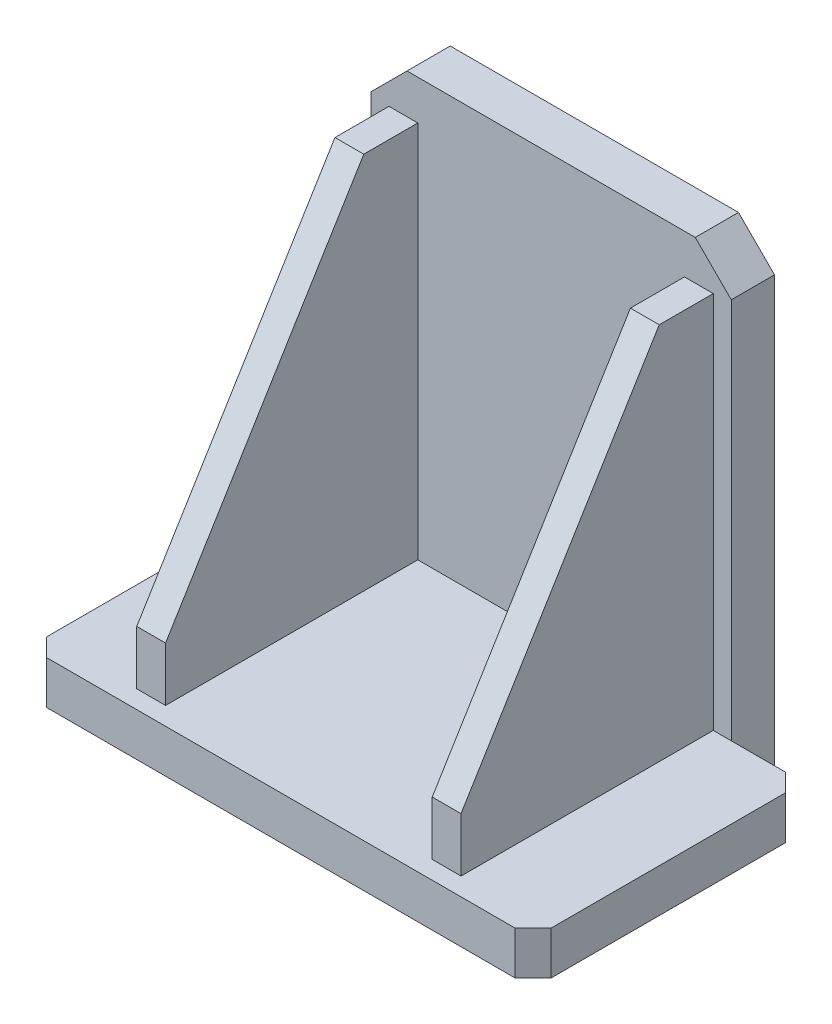
ISO-10303-21;
HEADER;
FILE_DESCRIPTION(('STEP AP214'),'2;1');
FILE_NAME('part.step','',(''),(''),'','','');
FILE_SCHEMA(('AUTOMOTIVE_DESIGN { 1 0 10303 214 1 1 1 1 }'));
ENDSEC;
DATA;
#1=APPLICATION_CONTEXT('core data for automotive mechanical design processes');
#2=APPLICATION_PROTOCOL_DEFINITION('international standard','automotive_design',2000,#1);
#3=PRODUCT_CONTEXT('',#1,'mechanical');
#4=PRODUCT('Part','Part','',(#3));
#5=PRODUCT_RELATED_PRODUCT_CATEGORY('part','',(#4));
#6=PRODUCT_DEFINITION_FORMATION('','',#4);
#7=PRODUCT_DEFINITION_CONTEXT('part definition',#1,'design');
#8=PRODUCT_DEFINITION('design','',#6,#7);
#9=PRODUCT_DEFINITION_SHAPE('','',#8);
#10=(LENGTH_UNIT() NAMED_UNIT(*) SI_UNIT(.MILLI.,.METRE.));
#11=(NAMED_UNIT(*) PLANE_ANGLE_UNIT() SI_UNIT($,.RADIAN.));
#12=(NAMED_UNIT(*) SI_UNIT($,.STERADIAN.) SOLID_ANGLE_UNIT());
#13=UNCERTAINTY_MEASURE_WITH_UNIT(LENGTH_MEASURE(1.E-05),#10,'distance_accuracy_value','');
#14=(GEOMETRIC_REPRESENTATION_CONTEXT(3) GLOBAL_UNCERTAINTY_ASSIGNED_CONTEXT((#13)) GLOBAL_UNIT_ASSIGNED_CONTEXT((#10,
#11,#12)) REPRESENTATION_CONTEXT('',''));
#15=CARTESIAN_POINT('',(0.,0.,0.));
#16=DIRECTION('',(0.,0.,1.));
#17=DIRECTION('',(1.,0.,0.));
#18=AXIS2_PLACEMENT_3D('',#15,#16,#17);
#19=CARTESIAN_POINT('',(25.,117.,-75.));
#20=DIRECTION('',(0.,-1.,0.));
#21=DIRECTION('',(0.,0.,-1.));
#22=AXIS2_PLACEMENT_3D('',#19,#20,#21);
#23=PLANE('',#22);
#24=DIRECTION('',(0.,0.,-1.));
#25=VECTOR('',#24,1.);
#26=CARTESIAN_POINT('',(33.,117.,-75.));
#27=LINE('',#26,#25);
#28=CARTESIAN_POINT('',(33.,117.,-60.));
#29=VERTEX_POINT('',#28);
#30=CARTESIAN_POINT('',(33.,117.,-75.));
#31=VERTEX_POINT('',#30);
#32=EDGE_CURVE('E126',#29,#31,#27,.T.);
#33=ORIENTED_EDGE('',*,*,#32,.T.);
#34=DIRECTION('',(1.,0.,0.));
#35=VECTOR('',#34,1.);
#36=CARTESIAN_POINT('',(25.,117.,-75.));
#37=LINE('',#36,#35);
#38=CARTESIAN_POINT('',(25.,117.,-75.));
#39=VERTEX_POINT('',#38);
#40=EDGE_CURVE('E12',#39,#31,#37,.T.);
#41=ORIENTED_EDGE('',*,*,#40,.F.);
#42=DIRECTION('',(0.,0.,-1.));
#43=VECTOR('',#42,1.);
#44=CARTESIAN_POINT('',(25.,117.,-75.));
#45=LINE('',#44,#43);
#46=CARTESIAN_POINT('',(25.,117.,-60.));
#47=VERTEX_POINT('',#46);
#48=EDGE_CURVE('E134',#47,#39,#45,.T.);
#49=ORIENTED_EDGE('',*,*,#48,.F.);
#50=DIRECTION('',(1.,0.,0.));
#51=VECTOR('',#50,1.);
#52=CARTESIAN_POINT('',(25.,117.,-60.));
#53=LINE('',#52,#51);
#54=EDGE_CURVE('E122',#47,#29,#53,.T.);
#55=ORIENTED_EDGE('',*,*,#54,.T.);
#56=EDGE_LOOP('',(#33,#41,#49,#55));
#57=FACE_BOUND('',#56,.T.);
#58=ADVANCED_FACE('F52',(#57),#23,.F.);
#59=CARTESIAN_POINT('',(25.,12.,-75.));
#60=DIRECTION('',(0.,0.,1.));
#61=DIRECTION('',(1.,0.,0.));
#62=AXIS2_PLACEMENT_3D('',#59,#60,#61);
#63=PLANE('',#62);
#64=DIRECTION('',(0.,-1.,0.));
#65=VECTOR('',#64,1.);
#66=CARTESIAN_POINT('',(33.,12.,-75.));
#67=LINE('',#66,#65);
#68=CARTESIAN_POINT('',(33.,12.,-75.));
#69=VERTEX_POINT('',#68);
#70=EDGE_CURVE('E129',#31,#69,#67,.T.);
#71=ORIENTED_EDGE('',*,*,#70,.T.);
#72=DIRECTION('',(1.,0.,0.));
#73=VECTOR('',#72,1.);
#74=CARTESIAN_POINT('',(25.,12.,-75.));
#75=LINE('',#74,#73);
#76=CARTESIAN_POINT('',(25.,12.,-75.));
#77=VERTEX_POINT('',#76);
#78=EDGE_CURVE('E60',#77,#69,#75,.T.);
#79=ORIENTED_EDGE('',*,*,#78,.F.);
#80=DIRECTION('',(0.,-1.,0.));
#81=VECTOR('',#80,1.);
#82=CARTESIAN_POINT('',(25.,12.,-75.));
#83=LINE('',#82,#81);
#84=EDGE_CURVE('E102',#39,#77,#83,.T.);
#85=ORIENTED_EDGE('',*,*,#84,.F.);
#86=ORIENTED_EDGE('',*,*,#40,.T.);
#87=EDGE_LOOP('',(#71,#79,#85,#86));
#88=FACE_BOUND('',#87,.T.);
#89=ADVANCED_FACE('F153',(#88),#63,.F.);
#90=CARTESIAN_POINT('',(25.,12.,-75.));
#91=DIRECTION('',(0.,1.,0.));
#92=DIRECTION('',(0.,0.,1.));
#93=AXIS2_PLACEMENT_3D('',#90,#91,#92);
#94=PLANE('',#93);
#95=DIRECTION('',(0.,0.,1.));
#96=VECTOR('',#95,1.);
#97=CARTESIAN_POINT('',(33.,12.,-75.));
#98=LINE('',#97,#96);
#99=CARTESIAN_POINT('',(33.,12.,-5.));
#100=VERTEX_POINT('',#99);
#101=EDGE_CURVE('E117',#69,#100,#98,.T.);
#102=ORIENTED_EDGE('',*,*,#101,.T.);
#103=DIRECTION('',(1.,0.,0.));
#104=VECTOR('',#103,1.);
#105=CARTESIAN_POINT('',(25.,12.,-5.));
#106=LINE('',#105,#104);
#107=CARTESIAN_POINT('',(25.,12.,-5.));
#108=VERTEX_POINT('',#107);
#109=EDGE_CURVE('E114',#108,#100,#106,.T.);
#110=ORIENTED_EDGE('',*,*,#109,.F.);
#111=DIRECTION('',(0.,0.,1.));
#112=VECTOR('',#111,1.);
#113=CARTESIAN_POINT('',(25.,12.,-75.));
#114=LINE('',#113,#112);
#115=EDGE_CURVE('E106',#77,#108,#114,.T.);
#116=ORIENTED_EDGE('',*,*,#115,.F.);
#117=ORIENTED_EDGE('',*,*,#78,.T.);
#118=EDGE_LOOP('',(#102,#110,#116,#117));
#119=FACE_BOUND('',#118,.T.);
#120=ADVANCED_FACE('F115',(#119),#94,.F.);
#121=CARTESIAN_POINT('',(25.,12.,-5.));
#122=DIRECTION('',(0.,0.,-1.));
#123=DIRECTION('',(-1.,0.,0.));
#124=AXIS2_PLACEMENT_3D('',#121,#122,#123);
#125=PLANE('',#124);
#126=DIRECTION('',(0.,1.,0.));
#127=VECTOR('',#126,1.);
#128=CARTESIAN_POINT('',(33.,12.,-5.));
#129=LINE('',#128,#127);
#130=CARTESIAN_POINT('',(33.,27.,-5.));
#131=VERTEX_POINT('',#130);
#132=EDGE_CURVE('E88',#100,#131,#129,.T.);
#133=ORIENTED_EDGE('',*,*,#132,.T.);
#134=DIRECTION('',(1.,0.,0.));
#135=VECTOR('',#134,1.);
#136=CARTESIAN_POINT('',(25.,27.,-5.));
#137=LINE('',#136,#135);
#138=CARTESIAN_POINT('',(25.,27.,-5.));
#139=VERTEX_POINT('',#138);
#140=EDGE_CURVE('E118',#139,#131,#137,.T.);
#141=ORIENTED_EDGE('',*,*,#140,.F.);
#142=DIRECTION('',(0.,1.,0.));
#143=VECTOR('',#142,1.);
#144=CARTESIAN_POINT('',(25.,12.,-5.));
#145=LINE('',#144,#143);
#146=EDGE_CURVE('E110',#108,#139,#145,.T.);
#147=ORIENTED_EDGE('',*,*,#146,.F.);
#148=ORIENTED_EDGE('',*,*,#109,.T.);
#149=EDGE_LOOP('',(#133,#141,#147,#148));
#150=FACE_BOUND('',#149,.T.);
#151=ADVANCED_FACE('F120',(#150),#125,.F.);
#152=CARTESIAN_POINT('',(25.,117.,-60.));
#153=DIRECTION('',(0.,-0.521450009453975,-0.853281833651959));
#154=DIRECTION('',(0.,0.853281833651959,-0.521450009453975));
#155=AXIS2_PLACEMENT_3D('',#152,#153,#154);
#156=PLANE('',#155);
#157=DIRECTION('',(0.,0.853281833651959,-0.521450009453975));
#158=VECTOR('',#157,1.);
#159=CARTESIAN_POINT('',(33.,117.,-60.));
#160=LINE('',#159,#158);
#161=EDGE_CURVE('E94',#131,#29,#160,.T.);
#162=ORIENTED_EDGE('',*,*,#161,.T.);
#163=ORIENTED_EDGE('',*,*,#54,.F.);
#164=DIRECTION('',(0.,0.853281833651959,-0.521450009453975));
#165=VECTOR('',#164,1.);
#166=CARTESIAN_POINT('',(25.,117.,-60.));
#167=LINE('',#166,#165);
#168=EDGE_CURVE('E68',#139,#47,#167,.T.);
#169=ORIENTED_EDGE('',*,*,#168,.F.);
#170=ORIENTED_EDGE('',*,*,#140,.T.);
#171=EDGE_LOOP('',(#162,#163,#169,#170));
#172=FACE_BOUND('',#171,.T.);
#173=ADVANCED_FACE('F142',(#172),#156,.F.);
#174=CARTESIAN_POINT('',(25.,0.,0.));
#175=DIRECTION('',(-1.,0.,0.));
#176=DIRECTION('',(0.,0.,1.));
#177=AXIS2_PLACEMENT_3D('',#174,#175,#176);
#178=PLANE('',#177);
#179=ORIENTED_EDGE('',*,*,#48,.T.);
#180=ORIENTED_EDGE('',*,*,#84,.T.);
#181=ORIENTED_EDGE('',*,*,#115,.T.);
#182=ORIENTED_EDGE('',*,*,#146,.T.);
#183=ORIENTED_EDGE('',*,*,#168,.T.);
#184=EDGE_LOOP('',(#179,#180,#181,#182,#183));
#185=FACE_BOUND('',#184,.T.);
#186=ADVANCED_FACE('F108',(#185),#178,.T.);
#187=CARTESIAN_POINT('',(33.,0.,0.));
#188=DIRECTION('',(-1.,0.,0.));
#189=DIRECTION('',(0.,0.,1.));
#190=AXIS2_PLACEMENT_3D('',#187,#188,#189);
#191=PLANE('',#190);
#192=ORIENTED_EDGE('',*,*,#32,.F.);
#193=ORIENTED_EDGE('',*,*,#161,.F.);
#194=ORIENTED_EDGE('',*,*,#132,.F.);
#195=ORIENTED_EDGE('',*,*,#101,.F.);
#196=ORIENTED_EDGE('',*,*,#70,.F.);
#197=EDGE_LOOP('',(#192,#193,#194,#195,#196));
#198=FACE_BOUND('',#197,.T.);
#199=ADVANCED_FACE('F138',(#198),#191,.F.);
#200=CLOSED_SHELL('',(#58,#89,#120,#151,#173,#186,#199));
#201=MANIFOLD_SOLID_BREP('B2',#200);
#202=CARTESIAN_POINT('',(115.,117.,-75.));
#203=DIRECTION('',(0.,-1.,0.));
#204=DIRECTION('',(0.,0.,-1.));
#205=AXIS2_PLACEMENT_3D('',#202,#203,#204);
#206=PLANE('',#205);
#207=DIRECTION('',(0.,0.,1.));
#208=VECTOR('',#207,1.);
#209=CARTESIAN_POINT('',(107.,117.,-75.));
#210=LINE('',#209,#208);
#211=CARTESIAN_POINT('',(107.,117.,-75.));
#212=VERTEX_POINT('',#211);
#213=CARTESIAN_POINT('',(107.,117.,-60.));
#214=VERTEX_POINT('',#213);
#215=EDGE_CURVE('E286',#212,#214,#210,.T.);
#216=ORIENTED_EDGE('',*,*,#215,.T.);
#217=DIRECTION('',(-1.,0.,0.));
#218=VECTOR('',#217,1.);
#219=CARTESIAN_POINT('',(115.,117.,-60.));
#220=LINE('',#219,#218);
#221=CARTESIAN_POINT('',(115.,117.,-60.));
#222=VERTEX_POINT('',#221);
#223=EDGE_CURVE('E50',#222,#214,#220,.T.);
#224=ORIENTED_EDGE('',*,*,#223,.F.);
#225=DIRECTION('',(0.,0.,1.));
#226=VECTOR('',#225,1.);
#227=CARTESIAN_POINT('',(115.,117.,-75.));
#228=LINE('',#227,#226);
#229=CARTESIAN_POINT('',(115.,117.,-75.));
#230=VERTEX_POINT('',#229);
#231=EDGE_CURVE('E294',#230,#222,#228,.T.);
#232=ORIENTED_EDGE('',*,*,#231,.F.);
#233=DIRECTION('',(-1.,0.,0.));
#234=VECTOR('',#233,1.);
#235=CARTESIAN_POINT('',(115.,117.,-75.));
#236=LINE('',#235,#234);
#237=EDGE_CURVE('E282',#230,#212,#236,.T.);
#238=ORIENTED_EDGE('',*,*,#237,.T.);
#239=EDGE_LOOP('',(#216,#224,#232,#238));
#240=FACE_BOUND('',#239,.T.);
#241=ADVANCED_FACE('F212',(#240),#206,.F.);
#242=CARTESIAN_POINT('',(115.,117.,-60.));
#243=DIRECTION('',(0.,-0.521450009453975,-0.853281833651959));
#244=DIRECTION('',(0.,0.853281833651959,-0.521450009453975));
#245=AXIS2_PLACEMENT_3D('',#242,#243,#244);
#246=PLANE('',#245);
#247=DIRECTION('',(0.,-0.853281833651959,0.521450009453975));
#248=VECTOR('',#247,1.);
#249=CARTESIAN_POINT('',(107.,117.,-60.));
#250=LINE('',#249,#248);
#251=CARTESIAN_POINT('',(107.,27.,-5.));
#252=VERTEX_POINT('',#251);
#253=EDGE_CURVE('E289',#214,#252,#250,.T.);
#254=ORIENTED_EDGE('',*,*,#253,.T.);
#255=DIRECTION('',(-1.,0.,0.));
#256=VECTOR('',#255,1.);
#257=CARTESIAN_POINT('',(115.,27.,-5.00000000000001));
#258=LINE('',#257,#256);
#259=CARTESIAN_POINT('',(115.,27.,-5.00000000000001));
#260=VERTEX_POINT('',#259);
#261=EDGE_CURVE('E220',#260,#252,#258,.T.);
#262=ORIENTED_EDGE('',*,*,#261,.F.);
#263=DIRECTION('',(0.,-0.853281833651959,0.521450009453975));
#264=VECTOR('',#263,1.);
#265=CARTESIAN_POINT('',(115.,117.,-60.));
#266=LINE('',#265,#264);
#267=EDGE_CURVE('E262',#222,#260,#266,.T.);
#268=ORIENTED_EDGE('',*,*,#267,.F.);
#269=ORIENTED_EDGE('',*,*,#223,.T.);
#270=EDGE_LOOP('',(#254,#262,#268,#269));
#271=FACE_BOUND('',#270,.T.);
#272=ADVANCED_FACE('F313',(#271),#246,.F.);
#273=CARTESIAN_POINT('',(115.,12.,-5.00000000000001));
#274=DIRECTION('',(0.,0.,-1.));
#275=DIRECTION('',(-1.,0.,0.));
#276=AXIS2_PLACEMENT_3D('',#273,#274,#275);
#277=PLANE('',#276);
#278=DIRECTION('',(0.,-1.,0.));
#279=VECTOR('',#278,1.);
#280=CARTESIAN_POINT('',(107.,12.,-5.));
#281=LINE('',#280,#279);
#282=CARTESIAN_POINT('',(107.,12.,-5.));
#283=VERTEX_POINT('',#282);
#284=EDGE_CURVE('E277',#252,#283,#281,.T.);
#285=ORIENTED_EDGE('',*,*,#284,.T.);
#286=DIRECTION('',(-1.,0.,0.));
#287=VECTOR('',#286,1.);
#288=CARTESIAN_POINT('',(115.,12.,-5.00000000000001));
#289=LINE('',#288,#287);
#290=CARTESIAN_POINT('',(115.,12.,-5.00000000000001));
#291=VERTEX_POINT('',#290);
#292=EDGE_CURVE('E274',#291,#283,#289,.T.);
#293=ORIENTED_EDGE('',*,*,#292,.F.);
#294=DIRECTION('',(0.,-1.,0.));
#295=VECTOR('',#294,1.);
#296=CARTESIAN_POINT('',(115.,12.,-5.00000000000001));
#297=LINE('',#296,#295);
#298=EDGE_CURVE('E266',#260,#291,#297,.T.);
#299=ORIENTED_EDGE('',*,*,#298,.F.);
#300=ORIENTED_EDGE('',*,*,#261,.T.);
#301=EDGE_LOOP('',(#285,#293,#299,#300));
#302=FACE_BOUND('',#301,.T.);
#303=ADVANCED_FACE('F275',(#302),#277,.F.);
#304=CARTESIAN_POINT('',(115.,12.,-75.));
#305=DIRECTION('',(0.,1.,0.));
#306=DIRECTION('',(0.,0.,1.));
#307=AXIS2_PLACEMENT_3D('',#304,#305,#306);
#308=PLANE('',#307);
#309=DIRECTION('',(0.,0.,-1.));
#310=VECTOR('',#309,1.);
#311=CARTESIAN_POINT('',(107.,12.,-75.));
#312=LINE('',#311,#310);
#313=CARTESIAN_POINT('',(107.,12.,-75.));
#314=VERTEX_POINT('',#313);
#315=EDGE_CURVE('E248',#283,#314,#312,.T.);
#316=ORIENTED_EDGE('',*,*,#315,.T.);
#317=DIRECTION('',(-1.,0.,0.));
#318=VECTOR('',#317,1.);
#319=CARTESIAN_POINT('',(115.,12.,-75.));
#320=LINE('',#319,#318);
#321=CARTESIAN_POINT('',(115.,12.,-75.));
#322=VERTEX_POINT('',#321);
#323=EDGE_CURVE('E278',#322,#314,#320,.T.);
#324=ORIENTED_EDGE('',*,*,#323,.F.);
#325=DIRECTION('',(0.,0.,-1.));
#326=VECTOR('',#325,1.);
#327=CARTESIAN_POINT('',(115.,12.,-75.));
#328=LINE('',#327,#326);
#329=EDGE_CURVE('E270',#291,#322,#328,.T.);
#330=ORIENTED_EDGE('',*,*,#329,.F.);
#331=ORIENTED_EDGE('',*,*,#292,.T.);
#332=EDGE_LOOP('',(#316,#324,#330,#331));
#333=FACE_BOUND('',#332,.T.);
#334=ADVANCED_FACE('F280',(#333),#308,.F.);
#335=CARTESIAN_POINT('',(115.,12.,-75.));
#336=DIRECTION('',(0.,0.,1.));
#337=DIRECTION('',(1.,0.,0.));
#338=AXIS2_PLACEMENT_3D('',#335,#336,#337);
#339=PLANE('',#338);
#340=DIRECTION('',(0.,1.,0.));
#341=VECTOR('',#340,1.);
#342=CARTESIAN_POINT('',(107.,12.,-75.));
#343=LINE('',#342,#341);
#344=EDGE_CURVE('E254',#314,#212,#343,.T.);
#345=ORIENTED_EDGE('',*,*,#344,.T.);
#346=ORIENTED_EDGE('',*,*,#237,.F.);
#347=DIRECTION('',(0.,1.,0.));
#348=VECTOR('',#347,1.);
#349=CARTESIAN_POINT('',(115.,12.,-75.));
#350=LINE('',#349,#348);
#351=EDGE_CURVE('E228',#322,#230,#350,.T.);
#352=ORIENTED_EDGE('',*,*,#351,.F.);
#353=ORIENTED_EDGE('',*,*,#323,.T.);
#354=EDGE_LOOP('',(#345,#346,#352,#353));
#355=FACE_BOUND('',#354,.T.);
#356=ADVANCED_FACE('F302',(#355),#339,.F.);
#357=CARTESIAN_POINT('',(115.,0.,0.));
#358=DIRECTION('',(-1.,0.,0.));
#359=DIRECTION('',(0.,0.,1.));
#360=AXIS2_PLACEMENT_3D('',#357,#358,#359);
#361=PLANE('',#360);
#362=ORIENTED_EDGE('',*,*,#231,.T.);
#363=ORIENTED_EDGE('',*,*,#267,.T.);
#364=ORIENTED_EDGE('',*,*,#298,.T.);
#365=ORIENTED_EDGE('',*,*,#329,.T.);
#366=ORIENTED_EDGE('',*,*,#351,.T.);
#367=EDGE_LOOP('',(#362,#363,#364,#365,#366));
#368=FACE_BOUND('',#367,.T.);
#369=ADVANCED_FACE('F268',(#368),#361,.F.);
#370=CARTESIAN_POINT('',(107.,0.,0.));
#371=DIRECTION('',(-1.,0.,0.));
#372=DIRECTION('',(0.,0.,1.));
#373=AXIS2_PLACEMENT_3D('',#370,#371,#372);
#374=PLANE('',#373);
#375=ORIENTED_EDGE('',*,*,#215,.F.);
#376=ORIENTED_EDGE('',*,*,#344,.F.);
#377=ORIENTED_EDGE('',*,*,#315,.F.);
#378=ORIENTED_EDGE('',*,*,#284,.F.);
#379=ORIENTED_EDGE('',*,*,#253,.F.);
#380=EDGE_LOOP('',(#375,#376,#377,#378,#379));
#381=FACE_BOUND('',#380,.T.);
#382=ADVANCED_FACE('F298',(#381),#374,.T.);
#383=CLOSED_SHELL('',(#241,#272,#303,#334,#356,#369,#382));
#384=MANIFOLD_SOLID_BREP('B6',#383);
#385=CARTESIAN_POINT('',(0.,12.,-75.));
#386=DIRECTION('',(0.,0.,1.));
#387=DIRECTION('',(1.,0.,0.));
#388=AXIS2_PLACEMENT_3D('',#385,#386,#387);
#389=PLANE('',#388);
#390=DIRECTION('',(-1.,0.,0.));
#391=VECTOR('',#390,1.);
#392=CARTESIAN_POINT('',(0.,12.,-75.));
#393=LINE('',#392,#391);
#394=CARTESIAN_POINT('',(135.,12.,-75.));
#395=VERTEX_POINT('',#394);
#396=CARTESIAN_POINT('',(120.,12.,-75.));
#397=VERTEX_POINT('',#396);
#398=EDGE_CURVE('E538',#395,#397,#393,.T.);
#399=ORIENTED_EDGE('',*,*,#398,.F.);
#400=DIRECTION('',(0.,-1.,0.));
#401=VECTOR('',#400,1.);
#402=CARTESIAN_POINT('',(135.,12.,-75.));
#403=LINE('',#402,#401);
#404=CARTESIAN_POINT('',(135.,0.,-75.));
#405=VERTEX_POINT('',#404);
#406=EDGE_CURVE('E479',#395,#405,#403,.T.);
#407=ORIENTED_EDGE('',*,*,#406,.T.);
#408=DIRECTION('',(-1.,0.,0.));
#409=VECTOR('',#408,1.);
#410=CARTESIAN_POINT('',(0.,0.,-75.));
#411=LINE('',#410,#409);
#412=CARTESIAN_POINT('',(120.,0.,-75.));
#413=VERTEX_POINT('',#412);
#414=EDGE_CURVE('E475',#405,#413,#411,.T.);
#415=ORIENTED_EDGE('',*,*,#414,.T.);
#416=DIRECTION('',(0.,-1.,0.));
#417=VECTOR('',#416,1.);
#418=CARTESIAN_POINT('',(120.,128.,-75.));
#419=LINE('',#418,#417);
#420=EDGE_CURVE('E477',#397,#413,#419,.T.);
#421=ORIENTED_EDGE('',*,*,#420,.F.);
#422=EDGE_LOOP('',(#399,#407,#415,#421));
#423=FACE_BOUND('',#422,.T.);
#424=ADVANCED_FACE('F364',(#423),#389,.F.);
#425=CARTESIAN_POINT('',(0.,12.,0.));
#426=DIRECTION('',(1.,0.,0.));
#427=DIRECTION('',(0.,0.,-1.));
#428=AXIS2_PLACEMENT_3D('',#425,#426,#427);
#429=PLANE('',#428);
#430=DIRECTION('',(0.,0.,1.));
#431=VECTOR('',#430,1.);
#432=CARTESIAN_POINT('',(0.,12.,0.));
#433=LINE('',#432,#431);
#434=CARTESIAN_POINT('',(0.,12.,-70.));
#435=VERTEX_POINT('',#434);
#436=CARTESIAN_POINT('',(0.,12.,-5.00000000000003));
#437=VERTEX_POINT('',#436);
#438=EDGE_CURVE('E483',#435,#437,#433,.T.);
#439=ORIENTED_EDGE('',*,*,#438,.F.);
#440=DIRECTION('',(0.,-1.,0.));
#441=VECTOR('',#440,1.);
#442=CARTESIAN_POINT('',(0.,12.,-70.));
#443=LINE('',#442,#441);
#444=CARTESIAN_POINT('',(0.,0.,-70.));
#445=VERTEX_POINT('',#444);
#446=EDGE_CURVE('E580',#435,#445,#443,.T.);
#447=ORIENTED_EDGE('',*,*,#446,.T.);
#448=DIRECTION('',(0.,0.,1.));
#449=VECTOR('',#448,1.);
#450=CARTESIAN_POINT('',(0.,0.,0.));
#451=LINE('',#450,#449);
#452=CARTESIAN_POINT('',(0.,0.,-5.00000000000003));
#453=VERTEX_POINT('',#452);
#454=EDGE_CURVE('E526',#445,#453,#451,.T.);
#455=ORIENTED_EDGE('',*,*,#454,.T.);
#456=DIRECTION('',(0.,1.,0.));
#457=VECTOR('',#456,1.);
#458=CARTESIAN_POINT('',(0.,12.,-5.00000000000003));
#459=LINE('',#458,#457);
#460=EDGE_CURVE('E577',#453,#437,#459,.T.);
#461=ORIENTED_EDGE('',*,*,#460,.T.);
#462=EDGE_LOOP('',(#439,#447,#455,#461));
#463=FACE_BOUND('',#462,.T.);
#464=ADVANCED_FACE('F649',(#463),#429,.F.);
#465=CARTESIAN_POINT('',(0.,12.,0.));
#466=DIRECTION('',(0.,0.,-1.));
#467=DIRECTION('',(-1.,0.,0.));
#468=AXIS2_PLACEMENT_3D('',#465,#466,#467);
#469=PLANE('',#468);
#470=DIRECTION('',(1.,0.,0.));
#471=VECTOR('',#470,1.);
#472=CARTESIAN_POINT('',(0.,0.,0.));
#473=LINE('',#472,#471);
#474=CARTESIAN_POINT('',(5.,0.,0.));
#475=VERTEX_POINT('',#474);
#476=CARTESIAN_POINT('',(135.,0.,0.));
#477=VERTEX_POINT('',#476);
#478=EDGE_CURVE('E545',#475,#477,#473,.T.);
#479=ORIENTED_EDGE('',*,*,#478,.T.);
#480=DIRECTION('',(0.,1.,0.));
#481=VECTOR('',#480,1.);
#482=CARTESIAN_POINT('',(135.,12.,0.));
#483=LINE('',#482,#481);
#484=CARTESIAN_POINT('',(135.,12.,0.));
#485=VERTEX_POINT('',#484);
#486=EDGE_CURVE('E210',#477,#485,#483,.T.);
#487=ORIENTED_EDGE('',*,*,#486,.T.);
#488=DIRECTION('',(1.,0.,0.));
#489=VECTOR('',#488,1.);
#490=CARTESIAN_POINT('',(0.,12.,0.));
#491=LINE('',#490,#489);
#492=CARTESIAN_POINT('',(5.,12.,0.));
#493=VERTEX_POINT('',#492);
#494=EDGE_CURVE('E530',#493,#485,#491,.T.);
#495=ORIENTED_EDGE('',*,*,#494,.F.);
#496=DIRECTION('',(0.,-1.,0.));
#497=VECTOR('',#496,1.);
#498=CARTESIAN_POINT('',(5.,12.,0.));
#499=LINE('',#498,#497);
#500=EDGE_CURVE('E374',#493,#475,#499,.T.);
#501=ORIENTED_EDGE('',*,*,#500,.T.);
#502=EDGE_LOOP('',(#479,#487,#495,#501));
#503=FACE_BOUND('',#502,.T.);
#504=ADVANCED_FACE('F623',(#503),#469,.F.);
#505=CARTESIAN_POINT('',(140.,12.,0.));
#506=DIRECTION('',(-1.,0.,0.));
#507=DIRECTION('',(0.,0.,1.));
#508=AXIS2_PLACEMENT_3D('',#505,#506,#507);
#509=PLANE('',#508);
#510=DIRECTION('',(0.,0.,-1.));
#511=VECTOR('',#510,1.);
#512=CARTESIAN_POINT('',(140.,0.,0.));
#513=LINE('',#512,#511);
#514=CARTESIAN_POINT('',(140.,0.,-5.));
#515=VERTEX_POINT('',#514);
#516=CARTESIAN_POINT('',(140.,0.,-70.));
#517=VERTEX_POINT('',#516);
#518=EDGE_CURVE('E549',#515,#517,#513,.T.);
#519=ORIENTED_EDGE('',*,*,#518,.T.);
#520=DIRECTION('',(0.,1.,0.));
#521=VECTOR('',#520,1.);
#522=CARTESIAN_POINT('',(140.,12.,-70.));
#523=LINE('',#522,#521);
#524=CARTESIAN_POINT('',(140.,12.,-70.));
#525=VERTEX_POINT('',#524);
#526=EDGE_CURVE('E389',#517,#525,#523,.T.);
#527=ORIENTED_EDGE('',*,*,#526,.T.);
#528=DIRECTION('',(0.,0.,-1.));
#529=VECTOR('',#528,1.);
#530=CARTESIAN_POINT('',(140.,12.,0.));
#531=LINE('',#530,#529);
#532=CARTESIAN_POINT('',(140.,12.,-5.));
#533=VERTEX_POINT('',#532);
#534=EDGE_CURVE('E534',#533,#525,#531,.T.);
#535=ORIENTED_EDGE('',*,*,#534,.F.);
#536=DIRECTION('',(0.,-1.,0.));
#537=VECTOR('',#536,1.);
#538=CARTESIAN_POINT('',(140.,12.,-5.));
#539=LINE('',#538,#537);
#540=EDGE_CURVE('E612',#533,#515,#539,.T.);
#541=ORIENTED_EDGE('',*,*,#540,.T.);
#542=EDGE_LOOP('',(#519,#527,#535,#541));
#543=FACE_BOUND('',#542,.T.);
#544=ADVANCED_FACE('F632',(#543),#509,.F.);
#545=CARTESIAN_POINT('',(20.,0.,-75.));
#546=VERTEX_POINT('',#545);
#547=CARTESIAN_POINT('',(5.00000000000006,0.,-75.));
#548=VERTEX_POINT('',#547);
#549=EDGE_CURVE('E484',#546,#548,#411,.T.);
#550=ORIENTED_EDGE('',*,*,#549,.T.);
#551=DIRECTION('',(0.,1.,0.));
#552=VECTOR('',#551,1.);
#553=CARTESIAN_POINT('',(5.00000000000006,12.,-75.));
#554=LINE('',#553,#552);
#555=CARTESIAN_POINT('',(5.00000000000006,12.,-75.));
#556=VERTEX_POINT('',#555);
#557=EDGE_CURVE('E596',#548,#556,#554,.T.);
#558=ORIENTED_EDGE('',*,*,#557,.T.);
#559=CARTESIAN_POINT('',(20.,12.,-75.));
#560=VERTEX_POINT('',#559);
#561=EDGE_CURVE('E537',#560,#556,#393,.T.);
#562=ORIENTED_EDGE('',*,*,#561,.F.);
#563=DIRECTION('',(0.,-1.,0.));
#564=VECTOR('',#563,1.);
#565=CARTESIAN_POINT('',(20.,128.,-75.));
#566=LINE('',#565,#564);
#567=EDGE_CURVE('E498',#560,#546,#566,.T.);
#568=ORIENTED_EDGE('',*,*,#567,.T.);
#569=EDGE_LOOP('',(#550,#558,#562,#568));
#570=FACE_BOUND('',#569,.T.);
#571=ADVANCED_FACE('F651',(#570),#389,.F.);
#572=CARTESIAN_POINT('',(0.,12.,0.));
#573=DIRECTION('',(0.,-1.,0.));
#574=DIRECTION('',(0.,0.,-1.));
#575=AXIS2_PLACEMENT_3D('',#572,#573,#574);
#576=PLANE('',#575);
#577=ORIENTED_EDGE('',*,*,#561,.T.);
#578=DIRECTION('',(0.707106781186549,0.,-0.707106781186546));
#579=VECTOR('',#578,1.);
#580=CARTESIAN_POINT('',(0.,12.,-70.));
#581=LINE('',#580,#579);
#582=EDGE_CURVE('E607',#556,#435,#581,.F.);
#583=ORIENTED_EDGE('',*,*,#582,.T.);
#584=ORIENTED_EDGE('',*,*,#438,.T.);
#585=DIRECTION('',(-0.707106781186546,0.,-0.707106781186549));
#586=VECTOR('',#585,1.);
#587=CARTESIAN_POINT('',(5.,12.,0.));
#588=LINE('',#587,#586);
#589=EDGE_CURVE('E599',#437,#493,#588,.F.);
#590=ORIENTED_EDGE('',*,*,#589,.T.);
#591=ORIENTED_EDGE('',*,*,#494,.T.);
#592=DIRECTION('',(-0.707106781186549,0.,0.707106781186546));
#593=VECTOR('',#592,1.);
#594=CARTESIAN_POINT('',(140.,12.,-5.));
#595=LINE('',#594,#593);
#596=EDGE_CURVE('E602',#485,#533,#595,.F.);
#597=ORIENTED_EDGE('',*,*,#596,.T.);
#598=ORIENTED_EDGE('',*,*,#534,.T.);
#599=DIRECTION('',(0.707106781186544,0.,0.707106781186551));
#600=VECTOR('',#599,1.);
#601=CARTESIAN_POINT('',(135.,12.,-75.));
#602=LINE('',#601,#600);
#603=EDGE_CURVE('E381',#525,#395,#602,.F.);
#604=ORIENTED_EDGE('',*,*,#603,.T.);
#605=ORIENTED_EDGE('',*,*,#398,.T.);
#606=EDGE_CURVE('E541',#397,#560,#393,.T.);
#607=ORIENTED_EDGE('',*,*,#606,.T.);
#608=EDGE_LOOP('',(#577,#583,#584,#590,#591,#597,#598,#604,#605,#607));
#609=FACE_BOUND('',#608,.T.);
#610=ADVANCED_FACE('F634',(#609),#576,.F.);
#611=CARTESIAN_POINT('',(0.,0.,0.));
#612=DIRECTION('',(0.,-1.,0.));
#613=DIRECTION('',(0.,0.,-1.));
#614=AXIS2_PLACEMENT_3D('',#611,#612,#613);
#615=PLANE('',#614);
#616=ORIENTED_EDGE('',*,*,#454,.F.);
#617=DIRECTION('',(-0.707106781186549,0.,0.707106781186546));
#618=VECTOR('',#617,1.);
#619=CARTESIAN_POINT('',(-35.,0.,-35.0000000000002));
#620=LINE('',#619,#618);
#621=EDGE_CURVE('E593',#445,#548,#620,.F.);
#622=ORIENTED_EDGE('',*,*,#621,.T.);
#623=ORIENTED_EDGE('',*,*,#549,.F.);
#624=DIRECTION('',(0.,0.,1.));
#625=VECTOR('',#624,1.);
#626=CARTESIAN_POINT('',(20.,0.,-75.));
#627=LINE('',#626,#625);
#628=CARTESIAN_POINT('',(20.,0.,-87.));
#629=VERTEX_POINT('',#628);
#630=EDGE_CURVE('E506',#629,#546,#627,.T.);
#631=ORIENTED_EDGE('',*,*,#630,.F.);
#632=DIRECTION('',(-1.,0.,0.));
#633=VECTOR('',#632,1.);
#634=CARTESIAN_POINT('',(20.,0.,-87.));
#635=LINE('',#634,#633);
#636=CARTESIAN_POINT('',(120.,0.,-87.));
#637=VERTEX_POINT('',#636);
#638=EDGE_CURVE('E504',#637,#629,#635,.T.);
#639=ORIENTED_EDGE('',*,*,#638,.F.);
#640=DIRECTION('',(0.,0.,-1.));
#641=VECTOR('',#640,1.);
#642=CARTESIAN_POINT('',(120.,0.,-75.));
#643=LINE('',#642,#641);
#644=EDGE_CURVE('E491',#413,#637,#643,.T.);
#645=ORIENTED_EDGE('',*,*,#644,.F.);
#646=ORIENTED_EDGE('',*,*,#414,.F.);
#647=DIRECTION('',(-0.707106781186544,0.,-0.707106781186551));
#648=VECTOR('',#647,1.);
#649=CARTESIAN_POINT('',(105.000000000001,0.,-105.));
#650=LINE('',#649,#648);
#651=EDGE_CURVE('E590',#405,#517,#650,.F.);
#652=ORIENTED_EDGE('',*,*,#651,.T.);
#653=ORIENTED_EDGE('',*,*,#518,.F.);
#654=DIRECTION('',(0.707106781186549,0.,-0.707106781186546));
#655=VECTOR('',#654,1.);
#656=CARTESIAN_POINT('',(67.4999999999996,0.,67.5));
#657=LINE('',#656,#655);
#658=EDGE_CURVE('E587',#515,#477,#657,.F.);
#659=ORIENTED_EDGE('',*,*,#658,.T.);
#660=ORIENTED_EDGE('',*,*,#478,.F.);
#661=DIRECTION('',(0.707106781186546,0.,0.707106781186549));
#662=VECTOR('',#661,1.);
#663=CARTESIAN_POINT('',(2.50000000000002,0.,-2.5));
#664=LINE('',#663,#662);
#665=EDGE_CURVE('E584',#475,#453,#664,.F.);
#666=ORIENTED_EDGE('',*,*,#665,.T.);
#667=EDGE_LOOP('',(#616,#622,#623,#631,#639,#645,#646,#652,#653,#659,#660,#666));
#668=FACE_BOUND('',#667,.T.);
#669=ADVANCED_FACE('F501',(#668),#615,.T.);
#670=CARTESIAN_POINT('',(20.,128.,-75.));
#671=DIRECTION('',(1.,0.,0.));
#672=DIRECTION('',(0.,0.,-1.));
#673=AXIS2_PLACEMENT_3D('',#670,#671,#672);
#674=PLANE('',#673);
#675=CARTESIAN_POINT('',(20.,118.,-75.));
#676=VERTEX_POINT('',#675);
#677=EDGE_CURVE('E523',#676,#560,#566,.T.);
#678=ORIENTED_EDGE('',*,*,#677,.F.);
#679=DIRECTION('',(0.,0.,-1.));
#680=VECTOR('',#679,1.);
#681=CARTESIAN_POINT('',(20.,118.,-75.));
#682=LINE('',#681,#680);
#683=CARTESIAN_POINT('',(20.,118.,-87.));
#684=VERTEX_POINT('',#683);
#685=EDGE_CURVE('E565',#676,#684,#682,.T.);
#686=ORIENTED_EDGE('',*,*,#685,.T.);
#687=DIRECTION('',(0.,-1.,0.));
#688=VECTOR('',#687,1.);
#689=CARTESIAN_POINT('',(20.,128.,-87.));
#690=LINE('',#689,#688);
#691=EDGE_CURVE('E515',#684,#629,#690,.T.);
#692=ORIENTED_EDGE('',*,*,#691,.T.);
#693=ORIENTED_EDGE('',*,*,#630,.T.);
#694=ORIENTED_EDGE('',*,*,#567,.F.);
#695=EDGE_LOOP('',(#678,#686,#692,#693,#694));
#696=FACE_BOUND('',#695,.T.);
#697=ADVANCED_FACE('F706',(#696),#674,.F.);
#698=CARTESIAN_POINT('',(20.,128.,-75.));
#699=DIRECTION('',(0.,0.,-1.));
#700=DIRECTION('',(-1.,0.,0.));
#701=AXIS2_PLACEMENT_3D('',#698,#699,#700);
#702=PLANE('',#701);
#703=DIRECTION('',(1.,0.,0.));
#704=VECTOR('',#703,1.);
#705=CARTESIAN_POINT('',(20.,128.,-75.));
#706=LINE('',#705,#704);
#707=CARTESIAN_POINT('',(30.,128.,-75.));
#708=VERTEX_POINT('',#707);
#709=CARTESIAN_POINT('',(110.,128.,-75.));
#710=VERTEX_POINT('',#709);
#711=EDGE_CURVE('E510',#708,#710,#706,.T.);
#712=ORIENTED_EDGE('',*,*,#711,.F.);
#713=DIRECTION('',(0.707106781186546,0.707106781186549,0.));
#714=VECTOR('',#713,1.);
#715=CARTESIAN_POINT('',(30.,128.,-75.));
#716=LINE('',#715,#714);
#717=EDGE_CURVE('E562',#708,#676,#716,.F.);
#718=ORIENTED_EDGE('',*,*,#717,.T.);
#719=ORIENTED_EDGE('',*,*,#677,.T.);
#720=ORIENTED_EDGE('',*,*,#606,.F.);
#721=CARTESIAN_POINT('',(120.,118.,-75.));
#722=VERTEX_POINT('',#721);
#723=EDGE_CURVE('E494',#722,#397,#419,.T.);
#724=ORIENTED_EDGE('',*,*,#723,.F.);
#725=DIRECTION('',(0.707106781186547,-0.707106781186548,0.));
#726=VECTOR('',#725,1.);
#727=CARTESIAN_POINT('',(110.,128.,-75.));
#728=LINE('',#727,#726);
#729=EDGE_CURVE('E559',#722,#710,#728,.F.);
#730=ORIENTED_EDGE('',*,*,#729,.T.);
#731=EDGE_LOOP('',(#712,#718,#719,#720,#724,#730));
#732=FACE_BOUND('',#731,.T.);
#733=ADVANCED_FACE('F788',(#732),#702,.F.);
#734=CARTESIAN_POINT('',(120.,128.,-75.));
#735=DIRECTION('',(-1.,0.,0.));
#736=DIRECTION('',(0.,0.,1.));
#737=AXIS2_PLACEMENT_3D('',#734,#735,#736);
#738=PLANE('',#737);
#739=DIRECTION('',(0.,-1.,0.));
#740=VECTOR('',#739,1.);
#741=CARTESIAN_POINT('',(120.,128.,-87.));
#742=LINE('',#741,#740);
#743=CARTESIAN_POINT('',(120.,118.,-87.));
#744=VERTEX_POINT('',#743);
#745=EDGE_CURVE('E518',#744,#637,#742,.T.);
#746=ORIENTED_EDGE('',*,*,#745,.F.);
#747=DIRECTION('',(0.,0.,1.));
#748=VECTOR('',#747,1.);
#749=CARTESIAN_POINT('',(120.,118.,-75.));
#750=LINE('',#749,#748);
#751=EDGE_CURVE('E574',#744,#722,#750,.T.);
#752=ORIENTED_EDGE('',*,*,#751,.T.);
#753=ORIENTED_EDGE('',*,*,#723,.T.);
#754=ORIENTED_EDGE('',*,*,#420,.T.);
#755=ORIENTED_EDGE('',*,*,#644,.T.);
#756=EDGE_LOOP('',(#746,#752,#753,#754,#755));
#757=FACE_BOUND('',#756,.T.);
#758=ADVANCED_FACE('F490',(#757),#738,.F.);
#759=CARTESIAN_POINT('',(20.,128.,-87.));
#760=DIRECTION('',(0.,0.,1.));
#761=DIRECTION('',(1.,0.,0.));
#762=AXIS2_PLACEMENT_3D('',#759,#760,#761);
#763=PLANE('',#762);
#764=ORIENTED_EDGE('',*,*,#691,.F.);
#765=DIRECTION('',(-0.707106781186546,-0.707106781186549,0.));
#766=VECTOR('',#765,1.);
#767=CARTESIAN_POINT('',(30.,128.,-87.));
#768=LINE('',#767,#766);
#769=CARTESIAN_POINT('',(30.,128.,-87.));
#770=VERTEX_POINT('',#769);
#771=EDGE_CURVE('E571',#684,#770,#768,.F.);
#772=ORIENTED_EDGE('',*,*,#771,.T.);
#773=DIRECTION('',(-1.,0.,0.));
#774=VECTOR('',#773,1.);
#775=CARTESIAN_POINT('',(20.,128.,-87.));
#776=LINE('',#775,#774);
#777=CARTESIAN_POINT('',(110.,128.,-87.));
#778=VERTEX_POINT('',#777);
#779=EDGE_CURVE('E519',#778,#770,#776,.T.);
#780=ORIENTED_EDGE('',*,*,#779,.F.);
#781=DIRECTION('',(-0.707106781186547,0.707106781186548,0.));
#782=VECTOR('',#781,1.);
#783=CARTESIAN_POINT('',(110.,128.,-87.));
#784=LINE('',#783,#782);
#785=EDGE_CURVE('E568',#778,#744,#784,.F.);
#786=ORIENTED_EDGE('',*,*,#785,.T.);
#787=ORIENTED_EDGE('',*,*,#745,.T.);
#788=ORIENTED_EDGE('',*,*,#638,.T.);
#789=EDGE_LOOP('',(#764,#772,#780,#786,#787,#788));
#790=FACE_BOUND('',#789,.T.);
#791=ADVANCED_FACE('F769',(#790),#763,.F.);
#792=CARTESIAN_POINT('',(0.,128.,0.));
#793=DIRECTION('',(0.,-1.,0.));
#794=DIRECTION('',(0.,0.,-1.));
#795=AXIS2_PLACEMENT_3D('',#792,#793,#794);
#796=PLANE('',#795);
#797=ORIENTED_EDGE('',*,*,#779,.T.);
#798=DIRECTION('',(0.,0.,1.));
#799=VECTOR('',#798,1.);
#800=CARTESIAN_POINT('',(30.,128.,0.));
#801=LINE('',#800,#799);
#802=EDGE_CURVE('E555',#770,#708,#801,.T.);
#803=ORIENTED_EDGE('',*,*,#802,.T.);
#804=ORIENTED_EDGE('',*,*,#711,.T.);
#805=DIRECTION('',(0.,0.,-1.));
#806=VECTOR('',#805,1.);
#807=CARTESIAN_POINT('',(110.,128.,0.));
#808=LINE('',#807,#806);
#809=EDGE_CURVE('E497',#710,#778,#808,.T.);
#810=ORIENTED_EDGE('',*,*,#809,.T.);
#811=EDGE_LOOP('',(#797,#803,#804,#810));
#812=FACE_BOUND('',#811,.T.);
#813=ADVANCED_FACE('F759',(#812),#796,.F.);
#814=CARTESIAN_POINT('',(30.,128.,0.));
#815=DIRECTION('',(0.707106781186549,-0.707106781186546,0.));
#816=DIRECTION('',(0.,0.,1.));
#817=AXIS2_PLACEMENT_3D('',#814,#815,#816);
#818=PLANE('',#817);
#819=ORIENTED_EDGE('',*,*,#771,.F.);
#820=ORIENTED_EDGE('',*,*,#685,.F.);
#821=ORIENTED_EDGE('',*,*,#717,.F.);
#822=ORIENTED_EDGE('',*,*,#802,.F.);
#823=EDGE_LOOP('',(#819,#820,#821,#822));
#824=FACE_BOUND('',#823,.T.);
#825=ADVANCED_FACE('F749',(#824),#818,.F.);
#826=CARTESIAN_POINT('',(110.,128.,0.));
#827=DIRECTION('',(-0.707106781186548,-0.707106781186547,0.));
#828=DIRECTION('',(0.,0.,-1.));
#829=AXIS2_PLACEMENT_3D('',#826,#827,#828);
#830=PLANE('',#829);
#831=ORIENTED_EDGE('',*,*,#729,.F.);
#832=ORIENTED_EDGE('',*,*,#751,.F.);
#833=ORIENTED_EDGE('',*,*,#785,.F.);
#834=ORIENTED_EDGE('',*,*,#809,.F.);
#835=EDGE_LOOP('',(#831,#832,#833,#834));
#836=FACE_BOUND('',#835,.T.);
#837=ADVANCED_FACE('F644',(#836),#830,.F.);
#838=CARTESIAN_POINT('',(0.,12.,-70.));
#839=DIRECTION('',(0.707106781186546,0.,0.707106781186549));
#840=DIRECTION('',(0.,-1.,0.));
#841=AXIS2_PLACEMENT_3D('',#838,#839,#840);
#842=PLANE('',#841);
#843=ORIENTED_EDGE('',*,*,#582,.F.);
#844=ORIENTED_EDGE('',*,*,#557,.F.);
#845=ORIENTED_EDGE('',*,*,#621,.F.);
#846=ORIENTED_EDGE('',*,*,#446,.F.);
#847=EDGE_LOOP('',(#843,#844,#845,#846));
#848=FACE_BOUND('',#847,.T.);
#849=ADVANCED_FACE('F638',(#848),#842,.F.);
#850=CARTESIAN_POINT('',(135.,12.,-75.));
#851=DIRECTION('',(-0.707106781186551,0.,0.707106781186544));
#852=DIRECTION('',(0.,-1.,0.));
#853=AXIS2_PLACEMENT_3D('',#850,#851,#852);
#854=PLANE('',#853);
#855=ORIENTED_EDGE('',*,*,#603,.F.);
#856=ORIENTED_EDGE('',*,*,#526,.F.);
#857=ORIENTED_EDGE('',*,*,#651,.F.);
#858=ORIENTED_EDGE('',*,*,#406,.F.);
#859=EDGE_LOOP('',(#855,#856,#857,#858));
#860=FACE_BOUND('',#859,.T.);
#861=ADVANCED_FACE('F636',(#860),#854,.F.);
#862=CARTESIAN_POINT('',(140.,12.,-5.));
#863=DIRECTION('',(-0.707106781186545,0.,-0.707106781186549));
#864=DIRECTION('',(0.,-1.,0.));
#865=AXIS2_PLACEMENT_3D('',#862,#863,#864);
#866=PLANE('',#865);
#867=ORIENTED_EDGE('',*,*,#596,.F.);
#868=ORIENTED_EDGE('',*,*,#486,.F.);
#869=ORIENTED_EDGE('',*,*,#658,.F.);
#870=ORIENTED_EDGE('',*,*,#540,.F.);
#871=EDGE_LOOP('',(#867,#868,#869,#870));
#872=FACE_BOUND('',#871,.T.);
#873=ADVANCED_FACE('F631',(#872),#866,.F.);
#874=CARTESIAN_POINT('',(5.,12.,0.));
#875=DIRECTION('',(0.707106781186549,0.,-0.707106781186545));
#876=DIRECTION('',(0.,-1.,0.));
#877=AXIS2_PLACEMENT_3D('',#874,#875,#876);
#878=PLANE('',#877);
#879=ORIENTED_EDGE('',*,*,#589,.F.);
#880=ORIENTED_EDGE('',*,*,#460,.F.);
#881=ORIENTED_EDGE('',*,*,#665,.F.);
#882=ORIENTED_EDGE('',*,*,#500,.F.);
#883=EDGE_LOOP('',(#879,#880,#881,#882));
#884=FACE_BOUND('',#883,.T.);
#885=ADVANCED_FACE('F367',(#884),#878,.F.);
#886=CLOSED_SHELL('',(#424,#464,#504,#544,#571,#610,#669,#697,#733,#758,#791,#813,#825,#837,
#849,#861,#873,#885));
#887=MANIFOLD_SOLID_BREP('B44',#886);
#888=ADVANCED_BREP_SHAPE_REPRESENTATION('',(#18,#201,#384,#887),#14);
#889=SHAPE_DEFINITION_REPRESENTATION(#9,#888);
ENDSEC;
END-ISO-10303-21;
